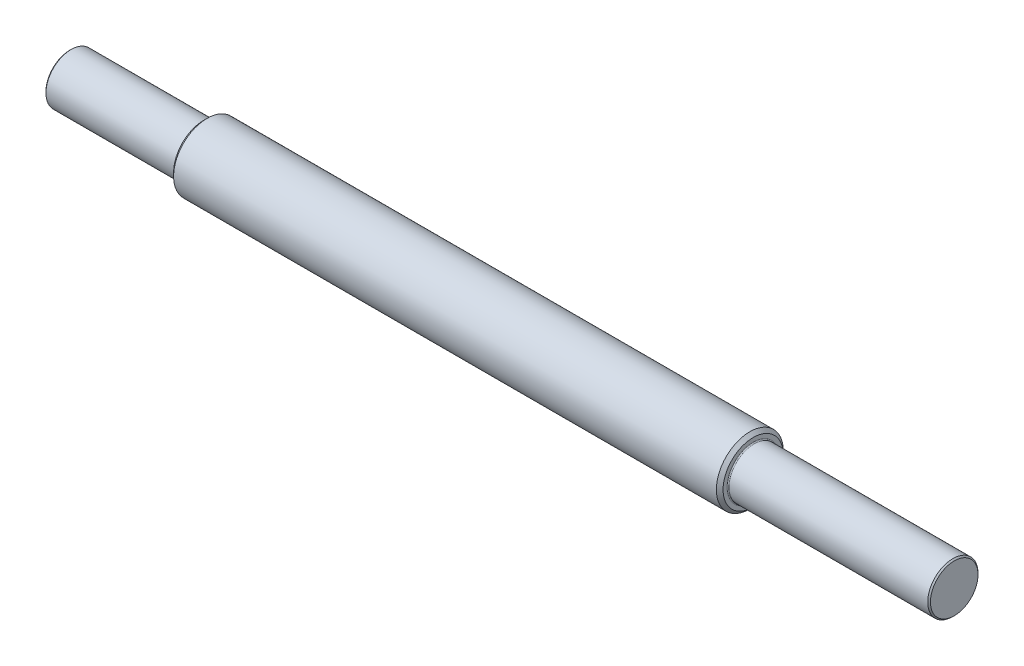
ISO-10303-21;
HEADER;
FILE_DESCRIPTION(('STEP AP214'),'2;1');
FILE_NAME('part.step','',(''),(''),'','','');
FILE_SCHEMA(('AUTOMOTIVE_DESIGN { 1 0 10303 214 1 1 1 1 }'));
ENDSEC;
DATA;
#1=APPLICATION_CONTEXT('core data for automotive mechanical design processes');
#2=APPLICATION_PROTOCOL_DEFINITION('international standard','automotive_design',2000,#1);
#3=PRODUCT_CONTEXT('',#1,'mechanical');
#4=PRODUCT('Part','Part','',(#3));
#5=PRODUCT_RELATED_PRODUCT_CATEGORY('part','',(#4));
#6=PRODUCT_DEFINITION_FORMATION('','',#4);
#7=PRODUCT_DEFINITION_CONTEXT('part definition',#1,'design');
#8=PRODUCT_DEFINITION('design','',#6,#7);
#9=PRODUCT_DEFINITION_SHAPE('','',#8);
#10=(LENGTH_UNIT() NAMED_UNIT(*) SI_UNIT(.MILLI.,.METRE.));
#11=(NAMED_UNIT(*) PLANE_ANGLE_UNIT() SI_UNIT($,.RADIAN.));
#12=(NAMED_UNIT(*) SI_UNIT($,.STERADIAN.) SOLID_ANGLE_UNIT());
#13=UNCERTAINTY_MEASURE_WITH_UNIT(LENGTH_MEASURE(1.E-05),#10,'distance_accuracy_value','');
#14=(GEOMETRIC_REPRESENTATION_CONTEXT(3) GLOBAL_UNCERTAINTY_ASSIGNED_CONTEXT((#13)) GLOBAL_UNIT_ASSIGNED_CONTEXT((#10,
#11,#12)) REPRESENTATION_CONTEXT('',''));
#15=CARTESIAN_POINT('',(0.,0.,0.));
#16=DIRECTION('',(0.,0.,1.));
#17=DIRECTION('',(1.,0.,0.));
#18=AXIS2_PLACEMENT_3D('',#15,#16,#17);
#19=CARTESIAN_POINT('',(-40.,0.,0.));
#20=DIRECTION('',(1.,0.,0.));
#21=DIRECTION('',(0.,0.,-1.));
#22=AXIS2_PLACEMENT_3D('',#19,#20,#21);
#23=PLANE('',#22);
#24=CARTESIAN_POINT('',(-40.,0.,0.));
#25=DIRECTION('',(1.,0.,0.));
#26=DIRECTION('',(0.,0.,-1.));
#27=AXIS2_PLACEMENT_3D('',#24,#25,#26);
#28=CIRCLE('',#27,7.1);
#29=CARTESIAN_POINT('',(-40.,0.,-7.1));
#30=VERTEX_POINT('',#29);
#31=EDGE_CURVE('E54',#30,#30,#28,.T.);
#32=ORIENTED_EDGE('',*,*,#31,.F.);
#33=EDGE_LOOP('',(#32));
#34=FACE_BOUND('',#33,.T.);
#35=ADVANCED_FACE('F13',(#34),#23,.F.);
#36=CARTESIAN_POINT('',(-40.,0.,0.));
#37=DIRECTION('',(1.,0.,0.));
#38=DIRECTION('',(0.,0.,-1.));
#39=AXIS2_PLACEMENT_3D('',#36,#37,#38);
#40=CONICAL_SURFACE('',#39,7.1,0.785398163397434);
#41=CARTESIAN_POINT('',(-39.6,0.,0.));
#42=DIRECTION('',(1.,0.,0.));
#43=DIRECTION('',(0.,0.,-1.));
#44=AXIS2_PLACEMENT_3D('',#41,#42,#43);
#45=CIRCLE('',#44,7.5);
#46=CARTESIAN_POINT('',(-39.6,0.,-7.5));
#47=VERTEX_POINT('',#46);
#48=EDGE_CURVE('E51',#47,#47,#45,.T.);
#49=ORIENTED_EDGE('',*,*,#48,.F.);
#50=EDGE_LOOP('',(#49));
#51=FACE_BOUND('',#50,.T.);
#52=ORIENTED_EDGE('',*,*,#31,.T.);
#53=EDGE_LOOP('',(#52));
#54=FACE_BOUND('',#53,.T.);
#55=ADVANCED_FACE('F58',(#51,#54),#40,.T.);
#56=CARTESIAN_POINT('',(224.,0.,0.));
#57=DIRECTION('',(1.,0.,0.));
#58=DIRECTION('',(0.,0.,-1.));
#59=AXIS2_PLACEMENT_3D('',#56,#57,#58);
#60=CYLINDRICAL_SURFACE('',#59,7.5);
#61=CARTESIAN_POINT('',(-0.299999999999994,0.,0.));
#62=DIRECTION('',(1.,0.,0.));
#63=DIRECTION('',(0.,0.,-1.));
#64=AXIS2_PLACEMENT_3D('',#61,#62,#63);
#65=CIRCLE('',#64,7.5);
#66=CARTESIAN_POINT('',(-0.299999999999994,0.,-7.5));
#67=VERTEX_POINT('',#66);
#68=EDGE_CURVE('E48',#67,#67,#65,.T.);
#69=ORIENTED_EDGE('',*,*,#68,.F.);
#70=EDGE_LOOP('',(#69));
#71=FACE_BOUND('',#70,.T.);
#72=ORIENTED_EDGE('',*,*,#48,.T.);
#73=EDGE_LOOP('',(#72));
#74=FACE_BOUND('',#73,.T.);
#75=ADVANCED_FACE('F66',(#71,#74),#60,.T.);
#76=CARTESIAN_POINT('',(-0.299999999999938,0.,0.));
#77=DIRECTION('',(1.,0.,0.));
#78=DIRECTION('',(0.,0.,-1.));
#79=AXIS2_PLACEMENT_3D('',#76,#77,#78);
#80=TOROIDAL_SURFACE('',#79,7.8,0.299999999999938);
#81=CARTESIAN_POINT('',(0.,0.,0.));
#82=DIRECTION('',(1.,0.,0.));
#83=DIRECTION('',(0.,0.,-1.));
#84=AXIS2_PLACEMENT_3D('',#81,#82,#83);
#85=CIRCLE('',#84,7.8);
#86=CARTESIAN_POINT('',(0.,0.,-7.8));
#87=VERTEX_POINT('',#86);
#88=EDGE_CURVE('E45',#87,#87,#85,.T.);
#89=ORIENTED_EDGE('',*,*,#88,.F.);
#90=EDGE_LOOP('',(#89));
#91=FACE_BOUND('',#90,.T.);
#92=ORIENTED_EDGE('',*,*,#68,.T.);
#93=EDGE_LOOP('',(#92));
#94=FACE_BOUND('',#93,.T.);
#95=ADVANCED_FACE('F72',(#91,#94),#80,.F.);
#96=CARTESIAN_POINT('',(0.,7.8,0.));
#97=DIRECTION('',(1.,0.,0.));
#98=DIRECTION('',(0.,0.,-1.));
#99=AXIS2_PLACEMENT_3D('',#96,#97,#98);
#100=PLANE('',#99);
#101=CARTESIAN_POINT('',(0.,0.,0.));
#102=DIRECTION('',(1.,0.,0.));
#103=DIRECTION('',(0.,0.,-1.));
#104=AXIS2_PLACEMENT_3D('',#101,#102,#103);
#105=CIRCLE('',#104,9.);
#106=CARTESIAN_POINT('',(0.,0.,-9.));
#107=VERTEX_POINT('',#106);
#108=EDGE_CURVE('E42',#107,#107,#105,.T.);
#109=ORIENTED_EDGE('',*,*,#108,.F.);
#110=EDGE_LOOP('',(#109));
#111=FACE_BOUND('',#110,.T.);
#112=ORIENTED_EDGE('',*,*,#88,.T.);
#113=EDGE_LOOP('',(#112));
#114=FACE_BOUND('',#113,.T.);
#115=ADVANCED_FACE('F76',(#111,#114),#100,.F.);
#116=CARTESIAN_POINT('',(0.,0.,0.));
#117=DIRECTION('',(1.,0.,0.));
#118=DIRECTION('',(0.,0.,-1.));
#119=AXIS2_PLACEMENT_3D('',#116,#117,#118);
#120=CONICAL_SURFACE('',#119,9.,0.785398163397448);
#121=CARTESIAN_POINT('',(1.,0.,0.));
#122=DIRECTION('',(1.,0.,0.));
#123=DIRECTION('',(0.,0.,-1.));
#124=AXIS2_PLACEMENT_3D('',#121,#122,#123);
#125=CIRCLE('',#124,10.);
#126=CARTESIAN_POINT('',(1.,0.,-10.));
#127=VERTEX_POINT('',#126);
#128=EDGE_CURVE('E39',#127,#127,#125,.T.);
#129=ORIENTED_EDGE('',*,*,#128,.F.);
#130=EDGE_LOOP('',(#129));
#131=FACE_BOUND('',#130,.T.);
#132=ORIENTED_EDGE('',*,*,#108,.T.);
#133=EDGE_LOOP('',(#132));
#134=FACE_BOUND('',#133,.T.);
#135=ADVANCED_FACE('F80',(#131,#134),#120,.T.);
#136=CARTESIAN_POINT('',(224.,0.,0.));
#137=DIRECTION('',(1.,0.,0.));
#138=DIRECTION('',(0.,0.,-1.));
#139=AXIS2_PLACEMENT_3D('',#136,#137,#138);
#140=CYLINDRICAL_SURFACE('',#139,10.);
#141=CARTESIAN_POINT('',(163.,0.,0.));
#142=DIRECTION('',(1.,0.,0.));
#143=DIRECTION('',(0.,0.,-1.));
#144=AXIS2_PLACEMENT_3D('',#141,#142,#143);
#145=CIRCLE('',#144,10.);
#146=CARTESIAN_POINT('',(163.,0.,-10.));
#147=VERTEX_POINT('',#146);
#148=EDGE_CURVE('E36',#147,#147,#145,.T.);
#149=ORIENTED_EDGE('',*,*,#148,.F.);
#150=EDGE_LOOP('',(#149));
#151=FACE_BOUND('',#150,.T.);
#152=ORIENTED_EDGE('',*,*,#128,.T.);
#153=EDGE_LOOP('',(#152));
#154=FACE_BOUND('',#153,.T.);
#155=ADVANCED_FACE('F84',(#151,#154),#140,.T.);
#156=CARTESIAN_POINT('',(163.,0.,0.));
#157=DIRECTION('',(-1.,0.,0.));
#158=DIRECTION('',(0.,0.,1.));
#159=AXIS2_PLACEMENT_3D('',#156,#157,#158);
#160=CONICAL_SURFACE('',#159,10.,0.785398163397448);
#161=CARTESIAN_POINT('',(164.,0.,0.));
#162=DIRECTION('',(1.,0.,0.));
#163=DIRECTION('',(0.,0.,-1.));
#164=AXIS2_PLACEMENT_3D('',#161,#162,#163);
#165=CIRCLE('',#164,9.);
#166=CARTESIAN_POINT('',(164.,0.,-9.));
#167=VERTEX_POINT('',#166);
#168=EDGE_CURVE('E33',#167,#167,#165,.T.);
#169=ORIENTED_EDGE('',*,*,#168,.F.);
#170=EDGE_LOOP('',(#169));
#171=FACE_BOUND('',#170,.T.);
#172=ORIENTED_EDGE('',*,*,#148,.T.);
#173=EDGE_LOOP('',(#172));
#174=FACE_BOUND('',#173,.T.);
#175=ADVANCED_FACE('F88',(#171,#174),#160,.T.);
#176=CARTESIAN_POINT('',(164.,9.,0.));
#177=DIRECTION('',(-1.,0.,0.));
#178=DIRECTION('',(0.,0.,1.));
#179=AXIS2_PLACEMENT_3D('',#176,#177,#178);
#180=PLANE('',#179);
#181=CARTESIAN_POINT('',(164.,0.,0.));
#182=DIRECTION('',(1.,0.,0.));
#183=DIRECTION('',(0.,0.,-1.));
#184=AXIS2_PLACEMENT_3D('',#181,#182,#183);
#185=CIRCLE('',#184,7.8000000709576);
#186=CARTESIAN_POINT('',(164.,0.,-7.8000000709576));
#187=VERTEX_POINT('',#186);
#188=EDGE_CURVE('E28',#187,#187,#185,.T.);
#189=ORIENTED_EDGE('',*,*,#188,.F.);
#190=EDGE_LOOP('',(#189));
#191=FACE_BOUND('',#190,.T.);
#192=ORIENTED_EDGE('',*,*,#168,.T.);
#193=EDGE_LOOP('',(#192));
#194=FACE_BOUND('',#193,.T.);
#195=ADVANCED_FACE('F92',(#191,#194),#180,.F.);
#196=CARTESIAN_POINT('',(164.299999999993,0.,0.));
#197=DIRECTION('',(1.,0.,0.));
#198=DIRECTION('',(0.,0.,-1.));
#199=AXIS2_PLACEMENT_3D('',#196,#197,#198);
#200=TOROIDAL_SURFACE('',#199,7.79999999999302,0.299999999993028);
#201=CARTESIAN_POINT('',(164.3,0.,0.));
#202=DIRECTION('',(1.,0.,0.));
#203=DIRECTION('',(0.,0.,-1.));
#204=AXIS2_PLACEMENT_3D('',#201,#202,#203);
#205=CIRCLE('',#204,7.5);
#206=CARTESIAN_POINT('',(164.3,0.,-7.5));
#207=VERTEX_POINT('',#206);
#208=EDGE_CURVE('E24',#207,#207,#205,.T.);
#209=ORIENTED_EDGE('',*,*,#208,.F.);
#210=EDGE_LOOP('',(#209));
#211=FACE_BOUND('',#210,.T.);
#212=ORIENTED_EDGE('',*,*,#188,.T.);
#213=EDGE_LOOP('',(#212));
#214=FACE_BOUND('',#213,.T.);
#215=ADVANCED_FACE('F96',(#211,#214),#200,.F.);
#216=CARTESIAN_POINT('',(224.,0.,0.));
#217=DIRECTION('',(1.,0.,0.));
#218=DIRECTION('',(0.,0.,-1.));
#219=AXIS2_PLACEMENT_3D('',#216,#217,#218);
#220=CYLINDRICAL_SURFACE('',#219,7.5);
#221=CARTESIAN_POINT('',(223.6,0.,0.));
#222=DIRECTION('',(1.,0.,0.));
#223=DIRECTION('',(0.,0.,-1.));
#224=AXIS2_PLACEMENT_3D('',#221,#222,#223);
#225=CIRCLE('',#224,7.5);
#226=CARTESIAN_POINT('',(223.6,0.,-7.5));
#227=VERTEX_POINT('',#226);
#228=EDGE_CURVE('E20',#227,#227,#225,.T.);
#229=ORIENTED_EDGE('',*,*,#228,.F.);
#230=EDGE_LOOP('',(#229));
#231=FACE_BOUND('',#230,.T.);
#232=ORIENTED_EDGE('',*,*,#208,.T.);
#233=EDGE_LOOP('',(#232));
#234=FACE_BOUND('',#233,.T.);
#235=ADVANCED_FACE('F100',(#231,#234),#220,.T.);
#236=CARTESIAN_POINT('',(223.6,0.,0.));
#237=DIRECTION('',(-1.,0.,0.));
#238=DIRECTION('',(0.,0.,1.));
#239=AXIS2_PLACEMENT_3D('',#236,#237,#238);
#240=CONICAL_SURFACE('',#239,7.5,0.785398163397434);
#241=CARTESIAN_POINT('',(224.,0.,0.));
#242=DIRECTION('',(1.,0.,0.));
#243=DIRECTION('',(0.,0.,-1.));
#244=AXIS2_PLACEMENT_3D('',#241,#242,#243);
#245=CIRCLE('',#244,7.10000000000001);
#246=CARTESIAN_POINT('',(224.,0.,-7.10000000000001));
#247=VERTEX_POINT('',#246);
#248=EDGE_CURVE('E8',#247,#247,#245,.T.);
#249=ORIENTED_EDGE('',*,*,#248,.F.);
#250=EDGE_LOOP('',(#249));
#251=FACE_BOUND('',#250,.T.);
#252=ORIENTED_EDGE('',*,*,#228,.T.);
#253=EDGE_LOOP('',(#252));
#254=FACE_BOUND('',#253,.T.);
#255=ADVANCED_FACE('F103',(#251,#254),#240,.T.);
#256=CARTESIAN_POINT('',(224.,7.1,0.));
#257=DIRECTION('',(-1.,0.,0.));
#258=DIRECTION('',(0.,0.,1.));
#259=AXIS2_PLACEMENT_3D('',#256,#257,#258);
#260=PLANE('',#259);
#261=ORIENTED_EDGE('',*,*,#248,.T.);
#262=EDGE_LOOP('',(#261));
#263=FACE_BOUND('',#262,.T.);
#264=ADVANCED_FACE('F15',(#263),#260,.F.);
#265=CLOSED_SHELL('',(#35,#55,#75,#95,#115,#135,#155,#175,#195,#215,#235,#255,#264));
#266=MANIFOLD_SOLID_BREP('B1',#265);
#267=ADVANCED_BREP_SHAPE_REPRESENTATION('',(#18,#266),#14);
#268=SHAPE_DEFINITION_REPRESENTATION(#9,#267);
ENDSEC;
END-ISO-10303-21;
